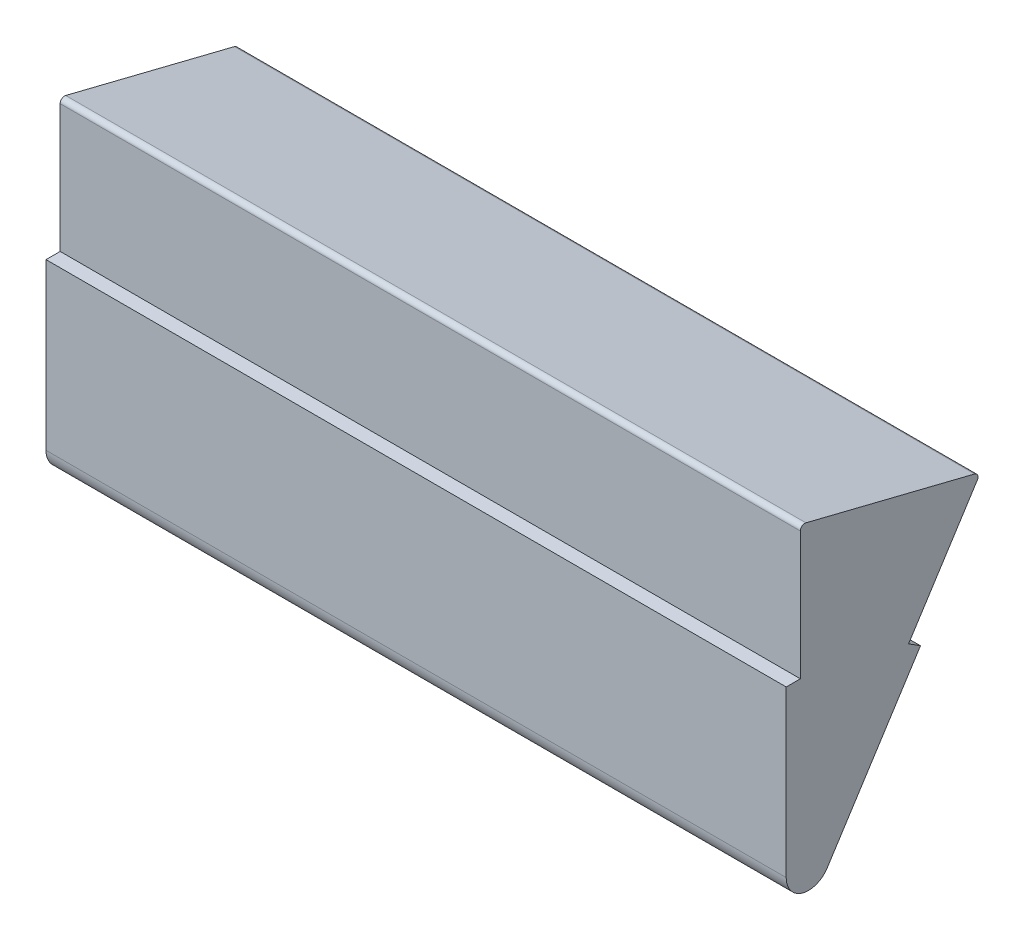
ISO-10303-21;
HEADER;
FILE_DESCRIPTION(('STEP AP214'),'2;1');
FILE_NAME('part.step','',(''),(''),'','','');
FILE_SCHEMA(('AUTOMOTIVE_DESIGN { 1 0 10303 214 1 1 1 1 }'));
ENDSEC;
DATA;
#1=APPLICATION_CONTEXT('core data for automotive mechanical design processes');
#2=APPLICATION_PROTOCOL_DEFINITION('international standard','automotive_design',2000,#1);
#3=PRODUCT_CONTEXT('',#1,'mechanical');
#4=PRODUCT('Part','Part','',(#3));
#5=PRODUCT_RELATED_PRODUCT_CATEGORY('part','',(#4));
#6=PRODUCT_DEFINITION_FORMATION('','',#4);
#7=PRODUCT_DEFINITION_CONTEXT('part definition',#1,'design');
#8=PRODUCT_DEFINITION('design','',#6,#7);
#9=PRODUCT_DEFINITION_SHAPE('','',#8);
#10=(LENGTH_UNIT() NAMED_UNIT(*) SI_UNIT(.MILLI.,.METRE.));
#11=(NAMED_UNIT(*) PLANE_ANGLE_UNIT() SI_UNIT($,.RADIAN.));
#12=(NAMED_UNIT(*) SI_UNIT($,.STERADIAN.) SOLID_ANGLE_UNIT());
#13=UNCERTAINTY_MEASURE_WITH_UNIT(LENGTH_MEASURE(1.E-05),#10,'distance_accuracy_value','');
#14=(GEOMETRIC_REPRESENTATION_CONTEXT(3) GLOBAL_UNCERTAINTY_ASSIGNED_CONTEXT((#13)) GLOBAL_UNIT_ASSIGNED_CONTEXT((#10,
#11,#12)) REPRESENTATION_CONTEXT('',''));
#15=CARTESIAN_POINT('',(0.,0.,0.));
#16=DIRECTION('',(0.,0.,1.));
#17=DIRECTION('',(1.,0.,0.));
#18=AXIS2_PLACEMENT_3D('',#15,#16,#17);
#19=CARTESIAN_POINT('',(166.124,-2.06129485259488,0.));
#20=DIRECTION('',(0.,0.,-1.));
#21=DIRECTION('',(0.,1.,0.));
#22=AXIS2_PLACEMENT_3D('',#19,#20,#21);
#23=PLANE('',#22);
#24=DIRECTION('',(0.,-1.,0.));
#25=VECTOR('',#24,1.);
#26=CARTESIAN_POINT('',(0.,-2.06129485259488,0.));
#27=LINE('',#26,#25);
#28=CARTESIAN_POINT('',(0.,35.,0.));
#29=VERTEX_POINT('',#28);
#30=CARTESIAN_POINT('',(0.,-2.06129485259511,0.));
#31=VERTEX_POINT('',#30);
#32=EDGE_CURVE('E144',#29,#31,#27,.T.);
#33=ORIENTED_EDGE('',*,*,#32,.T.);
#34=DIRECTION('',(-1.,0.,0.));
#35=VECTOR('',#34,1.);
#36=CARTESIAN_POINT('',(166.124,-2.06129485259511,0.));
#37=LINE('',#36,#35);
#38=CARTESIAN_POINT('',(166.124,-2.06129485259511,0.));
#39=VERTEX_POINT('',#38);
#40=EDGE_CURVE('E11',#39,#31,#37,.T.);
#41=ORIENTED_EDGE('',*,*,#40,.F.);
#42=DIRECTION('',(0.,-1.,0.));
#43=VECTOR('',#42,1.);
#44=CARTESIAN_POINT('',(166.124,-2.06129485259488,0.));
#45=LINE('',#44,#43);
#46=CARTESIAN_POINT('',(166.124,35.,0.));
#47=VERTEX_POINT('',#46);
#48=EDGE_CURVE('E162',#47,#39,#45,.T.);
#49=ORIENTED_EDGE('',*,*,#48,.F.);
#50=DIRECTION('',(-1.,0.,0.));
#51=VECTOR('',#50,1.);
#52=CARTESIAN_POINT('',(166.124,35.,0.));
#53=LINE('',#52,#51);
#54=EDGE_CURVE('E140',#47,#29,#53,.T.);
#55=ORIENTED_EDGE('',*,*,#54,.T.);
#56=EDGE_LOOP('',(#33,#41,#49,#55));
#57=FACE_BOUND('',#56,.T.);
#58=ADVANCED_FACE('F36',(#57),#23,.F.);
#59=CARTESIAN_POINT('',(166.124,-2.06129485259511,-5.));
#60=DIRECTION('',(-1.,0.,0.));
#61=DIRECTION('',(0.,0.,1.));
#62=AXIS2_PLACEMENT_3D('',#59,#60,#61);
#63=CYLINDRICAL_SURFACE('',#62,5.);
#64=CARTESIAN_POINT('',(0.,-2.06129485259511,-5.));
#65=DIRECTION('',(1.,0.,0.));
#66=DIRECTION('',(0.,0.,1.));
#67=AXIS2_PLACEMENT_3D('',#64,#65,#66);
#68=CIRCLE('',#67,5.);
#69=CARTESIAN_POINT('',(0.,-4.75654546845758,-9.21136843765693));
#70=VERTEX_POINT('',#69);
#71=EDGE_CURVE('E147',#31,#70,#68,.T.);
#72=ORIENTED_EDGE('',*,*,#71,.T.);
#73=DIRECTION('',(-1.,0.,0.));
#74=VECTOR('',#73,1.);
#75=CARTESIAN_POINT('',(166.124,-4.75654546845758,-9.21136843765693));
#76=LINE('',#75,#74);
#77=CARTESIAN_POINT('',(166.124,-4.75654546845758,-9.21136843765693));
#78=VERTEX_POINT('',#77);
#79=EDGE_CURVE('E44',#78,#70,#76,.T.);
#80=ORIENTED_EDGE('',*,*,#79,.F.);
#81=CARTESIAN_POINT('',(166.124,-2.06129485259511,-5.));
#82=DIRECTION('',(1.,0.,0.));
#83=DIRECTION('',(0.,0.,1.));
#84=AXIS2_PLACEMENT_3D('',#81,#82,#83);
#85=CIRCLE('',#84,5.);
#86=EDGE_CURVE('E101',#39,#78,#85,.T.);
#87=ORIENTED_EDGE('',*,*,#86,.F.);
#88=ORIENTED_EDGE('',*,*,#40,.T.);
#89=EDGE_LOOP('',(#72,#80,#87,#88));
#90=FACE_BOUND('',#89,.T.);
#91=ADVANCED_FACE('F211',(#90),#63,.T.);
#92=CARTESIAN_POINT('',(166.124,27.9412971745502,-30.1377921941074));
#93=DIRECTION('',(0.,0.539050123172533,0.842273687531361));
#94=DIRECTION('',(0.,-0.842273687531361,0.539050123172533));
#95=AXIS2_PLACEMENT_3D('',#92,#93,#94);
#96=PLANE('',#95);
#97=DIRECTION('',(0.,0.842273687531361,-0.539050123172533));
#98=VECTOR('',#97,1.);
#99=CARTESIAN_POINT('',(0.,27.9412971745502,-30.1377921941074));
#100=LINE('',#99,#98);
#101=CARTESIAN_POINT('',(0.,27.9412971745502,-30.1377921941074));
#102=VERTEX_POINT('',#101);
#103=EDGE_CURVE('E149',#70,#102,#100,.T.);
#104=ORIENTED_EDGE('',*,*,#103,.T.);
#105=DIRECTION('',(-1.,0.,0.));
#106=VECTOR('',#105,1.);
#107=CARTESIAN_POINT('',(166.124,27.9412971745502,-30.1377921941074));
#108=LINE('',#107,#106);
#109=CARTESIAN_POINT('',(166.124,27.9412971745502,-30.1377921941074));
#110=VERTEX_POINT('',#109);
#111=EDGE_CURVE('E175',#110,#102,#108,.T.);
#112=ORIENTED_EDGE('',*,*,#111,.F.);
#113=DIRECTION('',(0.,0.842273687531361,-0.539050123172533));
#114=VECTOR('',#113,1.);
#115=CARTESIAN_POINT('',(166.124,27.9412971745502,-30.1377921941074));
#116=LINE('',#115,#114);
#117=EDGE_CURVE('E183',#78,#110,#116,.T.);
#118=ORIENTED_EDGE('',*,*,#117,.F.);
#119=ORIENTED_EDGE('',*,*,#79,.T.);
#120=EDGE_LOOP('',(#104,#112,#118,#119));
#121=FACE_BOUND('',#120,.T.);
#122=ADVANCED_FACE('F181',(#121),#96,.F.);
#123=CARTESIAN_POINT('',(166.124,29.652781315623,-27.4635732361954));
#124=DIRECTION('',(0.,-0.842273687531361,0.539050123172533));
#125=DIRECTION('',(0.,-0.539050123172533,-0.842273687531361));
#126=AXIS2_PLACEMENT_3D('',#123,#124,#125);
#127=PLANE('',#126);
#128=DIRECTION('',(0.,0.539050123172533,0.842273687531361));
#129=VECTOR('',#128,1.);
#130=CARTESIAN_POINT('',(0.,29.652781315623,-27.4635732361954));
#131=LINE('',#130,#129);
#132=CARTESIAN_POINT('',(0.,29.652781315623,-27.4635732361954));
#133=VERTEX_POINT('',#132);
#134=EDGE_CURVE('E151',#102,#133,#131,.T.);
#135=ORIENTED_EDGE('',*,*,#134,.T.);
#136=DIRECTION('',(-1.,0.,0.));
#137=VECTOR('',#136,1.);
#138=CARTESIAN_POINT('',(166.124,29.652781315623,-27.4635732361954));
#139=LINE('',#138,#137);
#140=CARTESIAN_POINT('',(166.124,29.652781315623,-27.4635732361954));
#141=VERTEX_POINT('',#140);
#142=EDGE_CURVE('E172',#141,#133,#139,.T.);
#143=ORIENTED_EDGE('',*,*,#142,.F.);
#144=DIRECTION('',(0.,0.539050123172533,0.842273687531361));
#145=VECTOR('',#144,1.);
#146=CARTESIAN_POINT('',(166.124,29.652781315623,-27.4635732361954));
#147=LINE('',#146,#145);
#148=EDGE_CURVE('E201',#110,#141,#147,.T.);
#149=ORIENTED_EDGE('',*,*,#148,.F.);
#150=ORIENTED_EDGE('',*,*,#111,.T.);
#151=EDGE_LOOP('',(#135,#143,#149,#150));
#152=FACE_BOUND('',#151,.T.);
#153=ADVANCED_FACE('F192',(#152),#127,.F.);
#154=CARTESIAN_POINT('',(166.124,53.7481798086685,-42.8844841798058));
#155=DIRECTION('',(0.,0.539050123172534,0.842273687531361));
#156=DIRECTION('',(0.,-0.842273687531361,0.539050123172534));
#157=AXIS2_PLACEMENT_3D('',#154,#155,#156);
#158=PLANE('',#157);
#159=DIRECTION('',(0.,0.842273687531361,-0.539050123172534));
#160=VECTOR('',#159,1.);
#161=CARTESIAN_POINT('',(0.,53.7481798086685,-42.8844841798058));
#162=LINE('',#161,#160);
#163=CARTESIAN_POINT('',(0.,53.7481798086685,-42.8844841798058));
#164=VERTEX_POINT('',#163);
#165=EDGE_CURVE('E153',#133,#164,#162,.T.);
#166=ORIENTED_EDGE('',*,*,#165,.T.);
#167=DIRECTION('',(-1.,0.,0.));
#168=VECTOR('',#167,1.);
#169=CARTESIAN_POINT('',(166.124,53.7481798086685,-42.8844841798058));
#170=LINE('',#169,#168);
#171=CARTESIAN_POINT('',(166.124,53.7481798086685,-42.8844841798058));
#172=VERTEX_POINT('',#171);
#173=EDGE_CURVE('E169',#172,#164,#170,.T.);
#174=ORIENTED_EDGE('',*,*,#173,.F.);
#175=DIRECTION('',(0.,0.842273687531361,-0.539050123172534));
#176=VECTOR('',#175,1.);
#177=CARTESIAN_POINT('',(166.124,53.7481798086685,-42.8844841798058));
#178=LINE('',#177,#176);
#179=EDGE_CURVE('E198',#141,#172,#178,.T.);
#180=ORIENTED_EDGE('',*,*,#179,.F.);
#181=ORIENTED_EDGE('',*,*,#142,.T.);
#182=EDGE_LOOP('',(#166,#174,#180,#181));
#183=FACE_BOUND('',#182,.T.);
#184=ADVANCED_FACE('F196',(#183),#158,.F.);
#185=CARTESIAN_POINT('',(166.124,54.287229931841,-42.0422104922744));
#186=DIRECTION('',(-1.,0.,0.));
#187=DIRECTION('',(0.,0.,1.));
#188=AXIS2_PLACEMENT_3D('',#185,#186,#187);
#189=CYLINDRICAL_SURFACE('',#188,1.);
#190=CARTESIAN_POINT('',(0.,54.287229931841,-42.0422104922744));
#191=DIRECTION('',(1.,0.,0.));
#192=DIRECTION('',(0.,0.,1.));
#193=AXIS2_PLACEMENT_3D('',#190,#191,#192);
#194=CIRCLE('',#193,1.);
#195=CARTESIAN_POINT('',(0.,55.2575753028233,-42.2839331867267));
#196=VERTEX_POINT('',#195);
#197=EDGE_CURVE('E155',#164,#196,#194,.T.);
#198=ORIENTED_EDGE('',*,*,#197,.T.);
#199=DIRECTION('',(-1.,0.,0.));
#200=VECTOR('',#199,1.);
#201=CARTESIAN_POINT('',(166.124,55.2575753028233,-42.2839331867267));
#202=LINE('',#201,#200);
#203=CARTESIAN_POINT('',(166.124,55.2575753028233,-42.2839331867267));
#204=VERTEX_POINT('',#203);
#205=EDGE_CURVE('E166',#204,#196,#202,.T.);
#206=ORIENTED_EDGE('',*,*,#205,.F.);
#207=CARTESIAN_POINT('',(166.124,54.287229931841,-42.0422104922744));
#208=DIRECTION('',(1.,0.,0.));
#209=DIRECTION('',(0.,0.,1.));
#210=AXIS2_PLACEMENT_3D('',#207,#208,#209);
#211=CIRCLE('',#210,1.);
#212=EDGE_CURVE('E200',#172,#204,#211,.T.);
#213=ORIENTED_EDGE('',*,*,#212,.F.);
#214=ORIENTED_EDGE('',*,*,#173,.T.);
#215=EDGE_LOOP('',(#198,#206,#213,#214));
#216=FACE_BOUND('',#215,.T.);
#217=ADVANCED_FACE('F223',(#216),#189,.T.);
#218=CARTESIAN_POINT('',(166.124,64.6906745119404,-4.41672269445227));
#219=DIRECTION('',(0.,-0.970345370982281,0.241722694452257));
#220=DIRECTION('',(0.,-0.241722694452257,-0.970345370982281));
#221=AXIS2_PLACEMENT_3D('',#218,#219,#220);
#222=PLANE('',#221);
#223=DIRECTION('',(0.,0.241722694452257,0.970345370982281));
#224=VECTOR('',#223,1.);
#225=CARTESIAN_POINT('',(0.,64.6906745119404,-4.41672269445227));
#226=LINE('',#225,#224);
#227=CARTESIAN_POINT('',(0.,64.6906745119404,-4.41672269445226));
#228=VERTEX_POINT('',#227);
#229=EDGE_CURVE('E157',#196,#228,#226,.T.);
#230=ORIENTED_EDGE('',*,*,#229,.T.);
#231=DIRECTION('',(-1.,0.,0.));
#232=VECTOR('',#231,1.);
#233=CARTESIAN_POINT('',(166.124,64.6906745119404,-4.41672269445226));
#234=LINE('',#233,#232);
#235=CARTESIAN_POINT('',(166.124,64.6906745119404,-4.41672269445226));
#236=VERTEX_POINT('',#235);
#237=EDGE_CURVE('E135',#236,#228,#234,.T.);
#238=ORIENTED_EDGE('',*,*,#237,.F.);
#239=DIRECTION('',(0.,0.241722694452257,0.970345370982281));
#240=VECTOR('',#239,1.);
#241=CARTESIAN_POINT('',(166.124,64.6906745119404,-4.41672269445227));
#242=LINE('',#241,#240);
#243=EDGE_CURVE('E126',#204,#236,#242,.T.);
#244=ORIENTED_EDGE('',*,*,#243,.F.);
#245=ORIENTED_EDGE('',*,*,#205,.T.);
#246=EDGE_LOOP('',(#230,#238,#244,#245));
#247=FACE_BOUND('',#246,.T.);
#248=ADVANCED_FACE('F226',(#247),#222,.F.);
#249=CARTESIAN_POINT('',(166.124,63.7203291409581,-4.175));
#250=DIRECTION('',(-1.,0.,0.));
#251=DIRECTION('',(0.,0.,1.));
#252=AXIS2_PLACEMENT_3D('',#249,#250,#251);
#253=CYLINDRICAL_SURFACE('',#252,1.);
#254=CARTESIAN_POINT('',(0.,63.7203291409581,-4.175));
#255=DIRECTION('',(1.,0.,0.));
#256=DIRECTION('',(0.,0.,1.));
#257=AXIS2_PLACEMENT_3D('',#254,#255,#256);
#258=CIRCLE('',#257,1.);
#259=CARTESIAN_POINT('',(0.,63.7203291409581,-3.175));
#260=VERTEX_POINT('',#259);
#261=EDGE_CURVE('E134',#228,#260,#258,.T.);
#262=ORIENTED_EDGE('',*,*,#261,.T.);
#263=DIRECTION('',(-1.,0.,0.));
#264=VECTOR('',#263,1.);
#265=CARTESIAN_POINT('',(166.124,63.7203291409581,-3.175));
#266=LINE('',#265,#264);
#267=CARTESIAN_POINT('',(166.124,63.7203291409581,-3.175));
#268=VERTEX_POINT('',#267);
#269=EDGE_CURVE('E131',#268,#260,#266,.T.);
#270=ORIENTED_EDGE('',*,*,#269,.F.);
#271=CARTESIAN_POINT('',(166.124,63.7203291409581,-4.175));
#272=DIRECTION('',(1.,0.,0.));
#273=DIRECTION('',(0.,0.,1.));
#274=AXIS2_PLACEMENT_3D('',#271,#272,#273);
#275=CIRCLE('',#274,1.);
#276=EDGE_CURVE('E120',#236,#268,#275,.T.);
#277=ORIENTED_EDGE('',*,*,#276,.F.);
#278=ORIENTED_EDGE('',*,*,#237,.T.);
#279=EDGE_LOOP('',(#262,#270,#277,#278));
#280=FACE_BOUND('',#279,.T.);
#281=ADVANCED_FACE('F132',(#280),#253,.T.);
#282=CARTESIAN_POINT('',(166.124,35.,-3.175));
#283=DIRECTION('',(0.,0.,-1.));
#284=DIRECTION('',(-1.,0.,0.));
#285=AXIS2_PLACEMENT_3D('',#282,#283,#284);
#286=PLANE('',#285);
#287=DIRECTION('',(0.,-1.,0.));
#288=VECTOR('',#287,1.);
#289=CARTESIAN_POINT('',(0.,35.,-3.175));
#290=LINE('',#289,#288);
#291=CARTESIAN_POINT('',(0.,35.,-3.175));
#292=VERTEX_POINT('',#291);
#293=EDGE_CURVE('E87',#260,#292,#290,.T.);
#294=ORIENTED_EDGE('',*,*,#293,.T.);
#295=DIRECTION('',(-1.,0.,0.));
#296=VECTOR('',#295,1.);
#297=CARTESIAN_POINT('',(166.124,35.,-3.175));
#298=LINE('',#297,#296);
#299=CARTESIAN_POINT('',(166.124,35.,-3.175));
#300=VERTEX_POINT('',#299);
#301=EDGE_CURVE('E136',#300,#292,#298,.T.);
#302=ORIENTED_EDGE('',*,*,#301,.F.);
#303=DIRECTION('',(0.,-1.,0.));
#304=VECTOR('',#303,1.);
#305=CARTESIAN_POINT('',(166.124,35.,-3.175));
#306=LINE('',#305,#304);
#307=EDGE_CURVE('E124',#268,#300,#306,.T.);
#308=ORIENTED_EDGE('',*,*,#307,.F.);
#309=ORIENTED_EDGE('',*,*,#269,.T.);
#310=EDGE_LOOP('',(#294,#302,#308,#309));
#311=FACE_BOUND('',#310,.T.);
#312=ADVANCED_FACE('F138',(#311),#286,.F.);
#313=CARTESIAN_POINT('',(166.124,35.,0.));
#314=DIRECTION('',(0.,-1.,0.));
#315=DIRECTION('',(0.,0.,-1.));
#316=AXIS2_PLACEMENT_3D('',#313,#314,#315);
#317=PLANE('',#316);
#318=DIRECTION('',(0.,0.,1.));
#319=VECTOR('',#318,1.);
#320=CARTESIAN_POINT('',(0.,35.,0.));
#321=LINE('',#320,#319);
#322=EDGE_CURVE('E93',#292,#29,#321,.T.);
#323=ORIENTED_EDGE('',*,*,#322,.T.);
#324=ORIENTED_EDGE('',*,*,#54,.F.);
#325=DIRECTION('',(0.,0.,1.));
#326=VECTOR('',#325,1.);
#327=CARTESIAN_POINT('',(166.124,35.,0.));
#328=LINE('',#327,#326);
#329=EDGE_CURVE('E52',#300,#47,#328,.T.);
#330=ORIENTED_EDGE('',*,*,#329,.F.);
#331=ORIENTED_EDGE('',*,*,#301,.T.);
#332=EDGE_LOOP('',(#323,#324,#330,#331));
#333=FACE_BOUND('',#332,.T.);
#334=ADVANCED_FACE('F235',(#333),#317,.F.);
#335=CARTESIAN_POINT('',(166.124,63.7203291409581,-4.175));
#336=DIRECTION('',(-1.,0.,0.));
#337=DIRECTION('',(0.,0.,1.));
#338=AXIS2_PLACEMENT_3D('',#335,#336,#337);
#339=PLANE('',#338);
#340=ORIENTED_EDGE('',*,*,#48,.T.);
#341=ORIENTED_EDGE('',*,*,#86,.T.);
#342=ORIENTED_EDGE('',*,*,#117,.T.);
#343=ORIENTED_EDGE('',*,*,#148,.T.);
#344=ORIENTED_EDGE('',*,*,#179,.T.);
#345=ORIENTED_EDGE('',*,*,#212,.T.);
#346=ORIENTED_EDGE('',*,*,#243,.T.);
#347=ORIENTED_EDGE('',*,*,#276,.T.);
#348=ORIENTED_EDGE('',*,*,#307,.T.);
#349=ORIENTED_EDGE('',*,*,#329,.T.);
#350=EDGE_LOOP('',(#340,#341,#342,#343,#344,#345,#346,#347,#348,#349));
#351=FACE_BOUND('',#350,.T.);
#352=ADVANCED_FACE('F122',(#351),#339,.F.);
#353=CARTESIAN_POINT('',(0.,63.7203291409581,-4.175));
#354=DIRECTION('',(-1.,0.,0.));
#355=DIRECTION('',(0.,0.,1.));
#356=AXIS2_PLACEMENT_3D('',#353,#354,#355);
#357=PLANE('',#356);
#358=ORIENTED_EDGE('',*,*,#32,.F.);
#359=ORIENTED_EDGE('',*,*,#322,.F.);
#360=ORIENTED_EDGE('',*,*,#293,.F.);
#361=ORIENTED_EDGE('',*,*,#261,.F.);
#362=ORIENTED_EDGE('',*,*,#229,.F.);
#363=ORIENTED_EDGE('',*,*,#197,.F.);
#364=ORIENTED_EDGE('',*,*,#165,.F.);
#365=ORIENTED_EDGE('',*,*,#134,.F.);
#366=ORIENTED_EDGE('',*,*,#103,.F.);
#367=ORIENTED_EDGE('',*,*,#71,.F.);
#368=EDGE_LOOP('',(#358,#359,#360,#361,#362,#363,#364,#365,#366,#367));
#369=FACE_BOUND('',#368,.T.);
#370=ADVANCED_FACE('F187',(#369),#357,.T.);
#371=CLOSED_SHELL('',(#58,#91,#122,#153,#184,#217,#248,#281,#312,#334,#352,#370));
#372=MANIFOLD_SOLID_BREP('B2',#371);
#373=ADVANCED_BREP_SHAPE_REPRESENTATION('',(#18,#372),#14);
#374=SHAPE_DEFINITION_REPRESENTATION(#9,#373);
ENDSEC;
END-ISO-10303-21;
